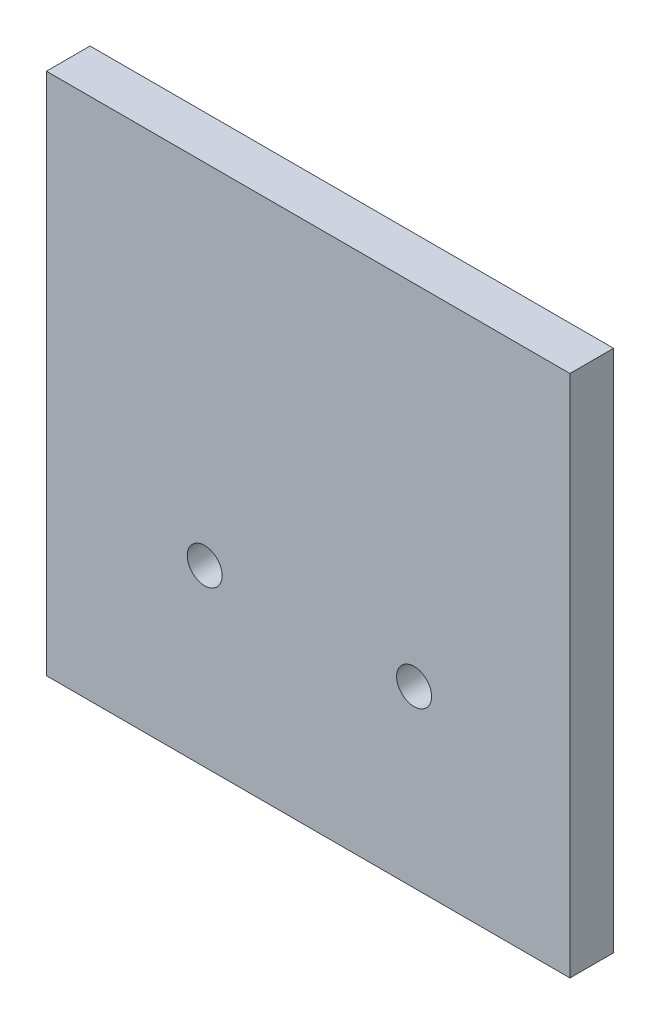
ISO-10303-21;
HEADER;
FILE_DESCRIPTION(('STEP AP214'),'2;1');
FILE_NAME('part.step','',(''),(''),'','','');
FILE_SCHEMA(('AUTOMOTIVE_DESIGN { 1 0 10303 214 1 1 1 1 }'));
ENDSEC;
DATA;
#1=APPLICATION_CONTEXT('core data for automotive mechanical design processes');
#2=APPLICATION_PROTOCOL_DEFINITION('international standard','automotive_design',2000,#1);
#3=PRODUCT_CONTEXT('',#1,'mechanical');
#4=PRODUCT('Part','Part','',(#3));
#5=PRODUCT_RELATED_PRODUCT_CATEGORY('part','',(#4));
#6=PRODUCT_DEFINITION_FORMATION('','',#4);
#7=PRODUCT_DEFINITION_CONTEXT('part definition',#1,'design');
#8=PRODUCT_DEFINITION('design','',#6,#7);
#9=PRODUCT_DEFINITION_SHAPE('','',#8);
#10=(LENGTH_UNIT() NAMED_UNIT(*) SI_UNIT(.MILLI.,.METRE.));
#11=(NAMED_UNIT(*) PLANE_ANGLE_UNIT() SI_UNIT($,.RADIAN.));
#12=(NAMED_UNIT(*) SI_UNIT($,.STERADIAN.) SOLID_ANGLE_UNIT());
#13=UNCERTAINTY_MEASURE_WITH_UNIT(LENGTH_MEASURE(1.E-05),#10,'distance_accuracy_value','');
#14=(GEOMETRIC_REPRESENTATION_CONTEXT(3) GLOBAL_UNCERTAINTY_ASSIGNED_CONTEXT((#13)) GLOBAL_UNIT_ASSIGNED_CONTEXT((#10,
#11,#12)) REPRESENTATION_CONTEXT('',''));
#15=CARTESIAN_POINT('',(0.,0.,0.));
#16=DIRECTION('',(0.,0.,1.));
#17=DIRECTION('',(1.,0.,0.));
#18=AXIS2_PLACEMENT_3D('',#15,#16,#17);
#19=CARTESIAN_POINT('',(149.311544093719,104.910714285714,25.));
#20=DIRECTION('',(0.,-1.,0.));
#21=DIRECTION('',(0.,0.,-1.));
#22=AXIS2_PLACEMENT_3D('',#19,#20,#21);
#23=PLANE('',#22);
#24=DIRECTION('',(-1.,0.,0.));
#25=VECTOR('',#24,1.);
#26=CARTESIAN_POINT('',(149.311544093719,104.910714285714,0.));
#27=LINE('',#26,#25);
#28=CARTESIAN_POINT('',(149.311544093719,104.910714285714,0.));
#29=VERTEX_POINT('',#28);
#30=CARTESIAN_POINT('',(-150.688455906281,104.910714285714,0.));
#31=VERTEX_POINT('',#30);
#32=EDGE_CURVE('E101',#29,#31,#27,.T.);
#33=ORIENTED_EDGE('',*,*,#32,.T.);
#34=DIRECTION('',(0.,0.,-1.));
#35=VECTOR('',#34,1.);
#36=CARTESIAN_POINT('',(-150.688455906281,104.910714285714,25.));
#37=LINE('',#36,#35);
#38=CARTESIAN_POINT('',(-150.688455906281,104.910714285714,25.));
#39=VERTEX_POINT('',#38);
#40=EDGE_CURVE('E11',#39,#31,#37,.T.);
#41=ORIENTED_EDGE('',*,*,#40,.F.);
#42=DIRECTION('',(-1.,0.,0.));
#43=VECTOR('',#42,1.);
#44=CARTESIAN_POINT('',(149.311544093719,104.910714285714,25.));
#45=LINE('',#44,#43);
#46=CARTESIAN_POINT('',(149.311544093719,104.910714285714,25.));
#47=VERTEX_POINT('',#46);
#48=EDGE_CURVE('E89',#47,#39,#45,.T.);
#49=ORIENTED_EDGE('',*,*,#48,.F.);
#50=DIRECTION('',(0.,0.,-1.));
#51=VECTOR('',#50,1.);
#52=CARTESIAN_POINT('',(149.311544093719,104.910714285714,25.));
#53=LINE('',#52,#51);
#54=EDGE_CURVE('E97',#47,#29,#53,.T.);
#55=ORIENTED_EDGE('',*,*,#54,.T.);
#56=EDGE_LOOP('',(#33,#41,#49,#55));
#57=FACE_BOUND('',#56,.T.);
#58=ADVANCED_FACE('F38',(#57),#23,.F.);
#59=CARTESIAN_POINT('',(-150.688455906281,104.910714285714,25.));
#60=DIRECTION('',(1.,0.,0.));
#61=DIRECTION('',(0.,1.,0.));
#62=AXIS2_PLACEMENT_3D('',#59,#60,#61);
#63=PLANE('',#62);
#64=DIRECTION('',(0.,-1.,0.));
#65=VECTOR('',#64,1.);
#66=CARTESIAN_POINT('',(-150.688455906281,104.910714285714,0.));
#67=LINE('',#66,#65);
#68=CARTESIAN_POINT('',(-150.688455906281,-195.089285714286,0.));
#69=VERTEX_POINT('',#68);
#70=EDGE_CURVE('E93',#31,#69,#67,.T.);
#71=ORIENTED_EDGE('',*,*,#70,.T.);
#72=DIRECTION('',(0.,0.,-1.));
#73=VECTOR('',#72,1.);
#74=CARTESIAN_POINT('',(-150.688455906281,-195.089285714286,25.));
#75=LINE('',#74,#73);
#76=CARTESIAN_POINT('',(-150.688455906281,-195.089285714286,25.));
#77=VERTEX_POINT('',#76);
#78=EDGE_CURVE('E46',#77,#69,#75,.T.);
#79=ORIENTED_EDGE('',*,*,#78,.F.);
#80=DIRECTION('',(0.,-1.,0.));
#81=VECTOR('',#80,1.);
#82=CARTESIAN_POINT('',(-150.688455906281,104.910714285714,25.));
#83=LINE('',#82,#81);
#84=EDGE_CURVE('E84',#39,#77,#83,.T.);
#85=ORIENTED_EDGE('',*,*,#84,.F.);
#86=ORIENTED_EDGE('',*,*,#40,.T.);
#87=EDGE_LOOP('',(#71,#79,#85,#86));
#88=FACE_BOUND('',#87,.T.);
#89=ADVANCED_FACE('F92',(#88),#63,.F.);
#90=CARTESIAN_POINT('',(-150.688455906281,-195.089285714286,25.));
#91=DIRECTION('',(0.,1.,0.));
#92=DIRECTION('',(0.,0.,1.));
#93=AXIS2_PLACEMENT_3D('',#90,#91,#92);
#94=PLANE('',#93);
#95=DIRECTION('',(1.,0.,0.));
#96=VECTOR('',#95,1.);
#97=CARTESIAN_POINT('',(-150.688455906281,-195.089285714286,0.));
#98=LINE('',#97,#96);
#99=CARTESIAN_POINT('',(149.311544093719,-195.089285714286,0.));
#100=VERTEX_POINT('',#99);
#101=EDGE_CURVE('E71',#69,#100,#98,.T.);
#102=ORIENTED_EDGE('',*,*,#101,.T.);
#103=DIRECTION('',(0.,0.,-1.));
#104=VECTOR('',#103,1.);
#105=CARTESIAN_POINT('',(149.311544093719,-195.089285714286,25.));
#106=LINE('',#105,#104);
#107=CARTESIAN_POINT('',(149.311544093719,-195.089285714286,25.));
#108=VERTEX_POINT('',#107);
#109=EDGE_CURVE('E94',#108,#100,#106,.T.);
#110=ORIENTED_EDGE('',*,*,#109,.F.);
#111=DIRECTION('',(1.,0.,0.));
#112=VECTOR('',#111,1.);
#113=CARTESIAN_POINT('',(-150.688455906281,-195.089285714286,25.));
#114=LINE('',#113,#112);
#115=EDGE_CURVE('E87',#77,#108,#114,.T.);
#116=ORIENTED_EDGE('',*,*,#115,.F.);
#117=ORIENTED_EDGE('',*,*,#78,.T.);
#118=EDGE_LOOP('',(#102,#110,#116,#117));
#119=FACE_BOUND('',#118,.T.);
#120=ADVANCED_FACE('F95',(#119),#94,.F.);
#121=CARTESIAN_POINT('',(149.311544093719,-195.089285714286,25.));
#122=DIRECTION('',(-1.,0.,0.));
#123=DIRECTION('',(0.,0.,1.));
#124=AXIS2_PLACEMENT_3D('',#121,#122,#123);
#125=PLANE('',#124);
#126=DIRECTION('',(0.,1.,0.));
#127=VECTOR('',#126,1.);
#128=CARTESIAN_POINT('',(149.311544093719,-195.089285714286,0.));
#129=LINE('',#128,#127);
#130=EDGE_CURVE('E77',#100,#29,#129,.T.);
#131=ORIENTED_EDGE('',*,*,#130,.T.);
#132=ORIENTED_EDGE('',*,*,#54,.F.);
#133=DIRECTION('',(0.,1.,0.));
#134=VECTOR('',#133,1.);
#135=CARTESIAN_POINT('',(149.311544093719,-195.089285714286,25.));
#136=LINE('',#135,#134);
#137=EDGE_CURVE('E54',#108,#47,#136,.T.);
#138=ORIENTED_EDGE('',*,*,#137,.F.);
#139=ORIENTED_EDGE('',*,*,#109,.T.);
#140=EDGE_LOOP('',(#131,#132,#138,#139));
#141=FACE_BOUND('',#140,.T.);
#142=ADVANCED_FACE('F109',(#141),#125,.F.);
#143=CARTESIAN_POINT('',(0.,0.,25.));
#144=DIRECTION('',(0.,0.,1.));
#145=DIRECTION('',(1.,0.,0.));
#146=AXIS2_PLACEMENT_3D('',#143,#144,#145);
#147=PLANE('',#146);
#148=CARTESIAN_POINT('',(-60.,-95.0892857142857,25.));
#149=DIRECTION('',(0.,0.,1.));
#150=DIRECTION('',(1.,0.,0.));
#151=AXIS2_PLACEMENT_3D('',#148,#149,#150);
#152=CIRCLE('',#151,10.);
#153=CARTESIAN_POINT('',(-50.,-95.0892857142857,25.));
#154=VERTEX_POINT('',#153);
#155=EDGE_CURVE('E121',#154,#154,#152,.T.);
#156=ORIENTED_EDGE('',*,*,#155,.F.);
#157=EDGE_LOOP('',(#156));
#158=FACE_BOUND('',#157,.T.);
#159=CARTESIAN_POINT('',(60.,-95.0892857142857,25.));
#160=DIRECTION('',(0.,0.,1.));
#161=DIRECTION('',(1.,0.,0.));
#162=AXIS2_PLACEMENT_3D('',#159,#160,#161);
#163=CIRCLE('',#162,9.99999999999999);
#164=CARTESIAN_POINT('',(70.,-95.0892857142857,25.));
#165=VERTEX_POINT('',#164);
#166=EDGE_CURVE('E115',#165,#165,#163,.T.);
#167=ORIENTED_EDGE('',*,*,#166,.F.);
#168=EDGE_LOOP('',(#167));
#169=FACE_BOUND('',#168,.T.);
#170=ORIENTED_EDGE('',*,*,#48,.T.);
#171=ORIENTED_EDGE('',*,*,#84,.T.);
#172=ORIENTED_EDGE('',*,*,#115,.T.);
#173=ORIENTED_EDGE('',*,*,#137,.T.);
#174=EDGE_LOOP('',(#170,#171,#172,#173));
#175=FACE_BOUND('',#174,.T.);
#176=ADVANCED_FACE('F85',(#158,#169,#175),#147,.T.);
#177=CARTESIAN_POINT('',(0.,0.,0.));
#178=DIRECTION('',(0.,0.,1.));
#179=DIRECTION('',(1.,0.,0.));
#180=AXIS2_PLACEMENT_3D('',#177,#178,#179);
#181=PLANE('',#180);
#182=CARTESIAN_POINT('',(-60.,-95.0892857142857,0.));
#183=DIRECTION('',(0.,0.,1.));
#184=DIRECTION('',(1.,0.,0.));
#185=AXIS2_PLACEMENT_3D('',#182,#183,#184);
#186=CIRCLE('',#185,10.);
#187=CARTESIAN_POINT('',(-50.,-95.0892857142857,0.));
#188=VERTEX_POINT('',#187);
#189=EDGE_CURVE('E104',#188,#188,#186,.T.);
#190=ORIENTED_EDGE('',*,*,#189,.T.);
#191=EDGE_LOOP('',(#190));
#192=FACE_BOUND('',#191,.T.);
#193=CARTESIAN_POINT('',(60.,-95.0892857142857,0.));
#194=DIRECTION('',(0.,0.,1.));
#195=DIRECTION('',(1.,0.,0.));
#196=AXIS2_PLACEMENT_3D('',#193,#194,#195);
#197=CIRCLE('',#196,9.99999999999999);
#198=CARTESIAN_POINT('',(70.,-95.0892857142857,0.));
#199=VERTEX_POINT('',#198);
#200=EDGE_CURVE('E118',#199,#199,#197,.T.);
#201=ORIENTED_EDGE('',*,*,#200,.T.);
#202=EDGE_LOOP('',(#201));
#203=FACE_BOUND('',#202,.T.);
#204=ORIENTED_EDGE('',*,*,#32,.F.);
#205=ORIENTED_EDGE('',*,*,#130,.F.);
#206=ORIENTED_EDGE('',*,*,#101,.F.);
#207=ORIENTED_EDGE('',*,*,#70,.F.);
#208=EDGE_LOOP('',(#204,#205,#206,#207));
#209=FACE_BOUND('',#208,.T.);
#210=ADVANCED_FACE('F112',(#192,#203,#209),#181,.F.);
#211=CARTESIAN_POINT('',(60.,-95.0892857142857,0.));
#212=DIRECTION('',(0.,0.,1.));
#213=DIRECTION('',(1.,0.,0.));
#214=AXIS2_PLACEMENT_3D('',#211,#212,#213);
#215=CYLINDRICAL_SURFACE('',#214,9.99999999999999);
#216=ORIENTED_EDGE('',*,*,#200,.F.);
#217=EDGE_LOOP('',(#216));
#218=FACE_BOUND('',#217,.T.);
#219=ORIENTED_EDGE('',*,*,#166,.T.);
#220=EDGE_LOOP('',(#219));
#221=FACE_BOUND('',#220,.T.);
#222=ADVANCED_FACE('F132',(#218,#221),#215,.F.);
#223=CARTESIAN_POINT('',(-60.,-95.0892857142857,0.));
#224=DIRECTION('',(0.,0.,1.));
#225=DIRECTION('',(1.,0.,0.));
#226=AXIS2_PLACEMENT_3D('',#223,#224,#225);
#227=CYLINDRICAL_SURFACE('',#226,10.);
#228=ORIENTED_EDGE('',*,*,#189,.F.);
#229=EDGE_LOOP('',(#228));
#230=FACE_BOUND('',#229,.T.);
#231=ORIENTED_EDGE('',*,*,#155,.T.);
#232=EDGE_LOOP('',(#231));
#233=FACE_BOUND('',#232,.T.);
#234=ADVANCED_FACE('F129',(#230,#233),#227,.F.);
#235=CLOSED_SHELL('',(#58,#89,#120,#142,#176,#210,#222,#234));
#236=MANIFOLD_SOLID_BREP('B2',#235);
#237=ADVANCED_BREP_SHAPE_REPRESENTATION('',(#18,#236),#14);
#238=SHAPE_DEFINITION_REPRESENTATION(#9,#237);
ENDSEC;
END-ISO-10303-21;
